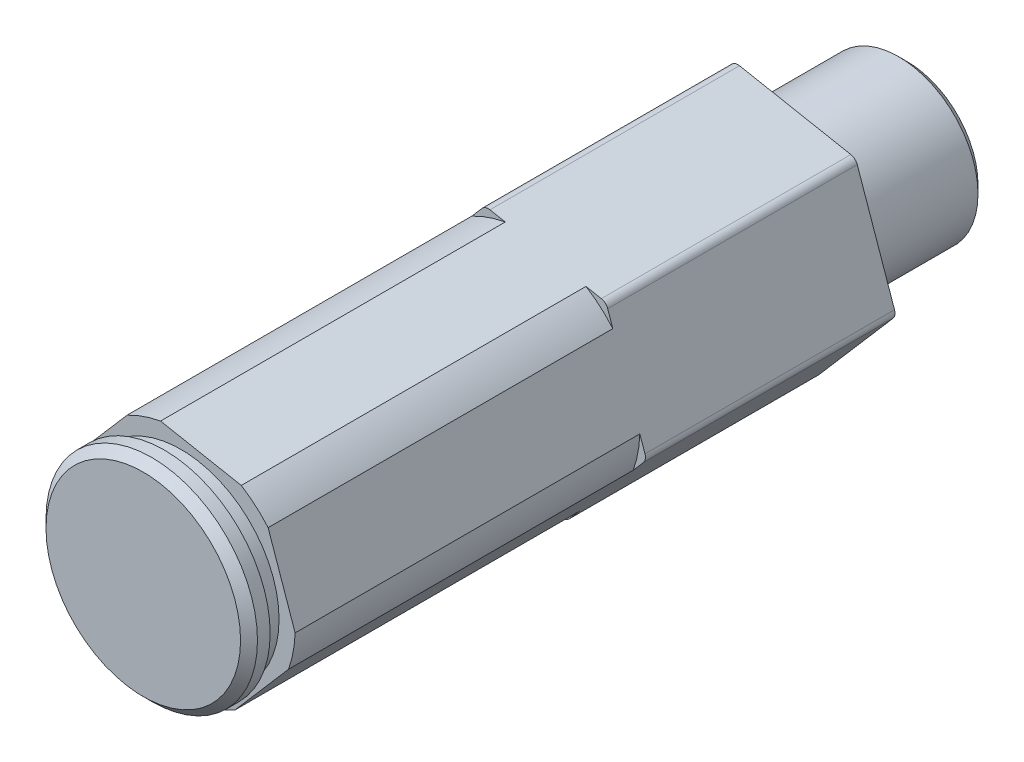
ISO-10303-21;
HEADER;
FILE_DESCRIPTION(('STEP AP214'),'2;1');
FILE_NAME('part.step','',(''),(''),'','','');
FILE_SCHEMA(('AUTOMOTIVE_DESIGN { 1 0 10303 214 1 1 1 1 }'));
ENDSEC;
DATA;
#1=APPLICATION_CONTEXT('core data for automotive mechanical design processes');
#2=APPLICATION_PROTOCOL_DEFINITION('international standard','automotive_design',2000,#1);
#3=PRODUCT_CONTEXT('',#1,'mechanical');
#4=PRODUCT('Part','Part','',(#3));
#5=PRODUCT_RELATED_PRODUCT_CATEGORY('part','',(#4));
#6=PRODUCT_DEFINITION_FORMATION('','',#4);
#7=PRODUCT_DEFINITION_CONTEXT('part definition',#1,'design');
#8=PRODUCT_DEFINITION('design','',#6,#7);
#9=PRODUCT_DEFINITION_SHAPE('','',#8);
#10=(LENGTH_UNIT() NAMED_UNIT(*) SI_UNIT(.MILLI.,.METRE.));
#11=(NAMED_UNIT(*) PLANE_ANGLE_UNIT() SI_UNIT($,.RADIAN.));
#12=(NAMED_UNIT(*) SI_UNIT($,.STERADIAN.) SOLID_ANGLE_UNIT());
#13=UNCERTAINTY_MEASURE_WITH_UNIT(LENGTH_MEASURE(1.E-05),#10,'distance_accuracy_value','');
#14=(GEOMETRIC_REPRESENTATION_CONTEXT(3) GLOBAL_UNCERTAINTY_ASSIGNED_CONTEXT((#13)) GLOBAL_UNIT_ASSIGNED_CONTEXT((#10,
#11,#12)) REPRESENTATION_CONTEXT('',''));
#15=CARTESIAN_POINT('',(0.,0.,0.));
#16=DIRECTION('',(0.,0.,1.));
#17=DIRECTION('',(1.,0.,0.));
#18=AXIS2_PLACEMENT_3D('',#15,#16,#17);
#19=CARTESIAN_POINT('',(0.,0.,22.9362));
#20=DIRECTION('',(0.,0.,1.));
#21=DIRECTION('',(1.,0.,0.));
#22=AXIS2_PLACEMENT_3D('',#19,#20,#21);
#23=CYLINDRICAL_SURFACE('',#22,6.862299966);
#24=CARTESIAN_POINT('',(0.,0.,-0.0254000000000018));
#25=DIRECTION('',(0.,0.,-1.));
#26=DIRECTION('',(-1.,0.,0.));
#27=AXIS2_PLACEMENT_3D('',#24,#25,#26);
#28=CIRCLE('',#27,6.862299966);
#29=CARTESIAN_POINT('',(6.85862382577054,-0.224588601527922,-0.0254000000000018));
#30=VERTEX_POINT('',#29);
#31=CARTESIAN_POINT('',(6.45951838185615,-2.31641600275642,-0.0254000000000018));
#32=VERTEX_POINT('',#31);
#33=EDGE_CURVE('E204',#30,#32,#28,.T.);
#34=ORIENTED_EDGE('',*,*,#33,.F.);
#35=DIRECTION('',(0.,0.,1.));
#36=VECTOR('',#35,1.);
#37=CARTESIAN_POINT('',(6.85862382577054,-0.224588601527922,22.9362));
#38=LINE('',#37,#36);
#39=CARTESIAN_POINT('',(6.85862382577054,-0.224588601527908,20.6756));
#40=VERTEX_POINT('',#39);
#41=EDGE_CURVE('E221',#40,#30,#38,.F.);
#42=ORIENTED_EDGE('',*,*,#41,.F.);
#43=CARTESIAN_POINT('',(0.,0.,20.6756));
#44=DIRECTION('',(0.,0.,1.));
#45=DIRECTION('',(1.,0.,0.));
#46=AXIS2_PLACEMENT_3D('',#43,#44,#45);
#47=CIRCLE('',#46,6.86229996599999);
#48=CARTESIAN_POINT('',(6.45951838185614,-2.31641600275645,20.6756));
#49=VERTEX_POINT('',#48);
#50=EDGE_CURVE('E207',#49,#40,#47,.T.);
#51=ORIENTED_EDGE('',*,*,#50,.F.);
#52=DIRECTION('',(0.,0.,1.));
#53=VECTOR('',#52,1.);
#54=CARTESIAN_POINT('',(6.45951838185615,-2.31641600275642,22.9362));
#55=LINE('',#54,#53);
#56=EDGE_CURVE('E201',#32,#49,#55,.T.);
#57=ORIENTED_EDGE('',*,*,#56,.F.);
#58=EDGE_LOOP('',(#34,#42,#51,#57));
#59=FACE_BOUND('',#58,.T.);
#60=ADVANCED_FACE('F38',(#59),#23,.T.);
#61=CARTESIAN_POINT('',(0.,0.,-0.0254000000000018));
#62=DIRECTION('',(0.,0.,-1.));
#63=DIRECTION('',(-1.,0.,0.));
#64=AXIS2_PLACEMENT_3D('',#61,#62,#63);
#65=CIRCLE('',#64,6.862299966);
#66=CARTESIAN_POINT('',(3.23481247856166,-6.05203676888247,-0.0254000000000018));
#67=VERTEX_POINT('',#66);
#68=CARTESIAN_POINT('',(1.2236840868082,-6.75231501627819,-0.0254000000000018));
#69=VERTEX_POINT('',#68);
#70=EDGE_CURVE('E222',#67,#69,#65,.T.);
#71=ORIENTED_EDGE('',*,*,#70,.F.);
#72=DIRECTION('',(0.,0.,1.));
#73=VECTOR('',#72,1.);
#74=CARTESIAN_POINT('',(3.23481247856166,-6.05203676888247,22.9362));
#75=LINE('',#74,#73);
#76=CARTESIAN_POINT('',(3.23481247856168,-6.05203676888245,20.6756));
#77=VERTEX_POINT('',#76);
#78=EDGE_CURVE('E212',#77,#67,#75,.F.);
#79=ORIENTED_EDGE('',*,*,#78,.F.);
#80=CARTESIAN_POINT('',(1.22368408680819,-6.75231501627819,20.6756));
#81=VERTEX_POINT('',#80);
#82=EDGE_CURVE('E487',#81,#77,#47,.T.);
#83=ORIENTED_EDGE('',*,*,#82,.F.);
#84=DIRECTION('',(0.,0.,1.));
#85=VECTOR('',#84,1.);
#86=CARTESIAN_POINT('',(1.2236840868082,-6.75231501627819,22.9362));
#87=LINE('',#86,#85);
#88=EDGE_CURVE('E284',#69,#81,#87,.T.);
#89=ORIENTED_EDGE('',*,*,#88,.F.);
#90=EDGE_LOOP('',(#71,#79,#83,#89));
#91=FACE_BOUND('',#90,.T.);
#92=ADVANCED_FACE('F448',(#91),#23,.T.);
#93=CARTESIAN_POINT('',(0.,0.,-0.0254000000000018));
#94=DIRECTION('',(0.,0.,-1.));
#95=DIRECTION('',(-1.,0.,0.));
#96=AXIS2_PLACEMENT_3D('',#93,#94,#95);
#97=CIRCLE('',#96,6.862299966);
#98=CARTESIAN_POINT('',(-3.62381134720887,-5.82744816735454,-0.0254000000000018));
#99=VERTEX_POINT('',#98);
#100=CARTESIAN_POINT('',(-5.23583429504795,-4.43589901352176,-0.0254000000000018));
#101=VERTEX_POINT('',#100);
#102=EDGE_CURVE('E246',#99,#101,#97,.T.);
#103=ORIENTED_EDGE('',*,*,#102,.F.);
#104=DIRECTION('',(0.,0.,1.));
#105=VECTOR('',#104,1.);
#106=CARTESIAN_POINT('',(-3.62381134720887,-5.82744816735454,22.9362));
#107=LINE('',#106,#105);
#108=CARTESIAN_POINT('',(-3.62381134720886,-5.82744816735454,20.6756));
#109=VERTEX_POINT('',#108);
#110=EDGE_CURVE('E281',#109,#99,#107,.F.);
#111=ORIENTED_EDGE('',*,*,#110,.F.);
#112=CARTESIAN_POINT('',(-5.23583429504796,-4.43589901352174,20.6756));
#113=VERTEX_POINT('',#112);
#114=EDGE_CURVE('E483',#113,#109,#47,.T.);
#115=ORIENTED_EDGE('',*,*,#114,.F.);
#116=DIRECTION('',(0.,0.,1.));
#117=VECTOR('',#116,1.);
#118=CARTESIAN_POINT('',(-5.23583429504795,-4.43589901352176,22.9362));
#119=LINE('',#118,#117);
#120=EDGE_CURVE('E276',#101,#113,#119,.T.);
#121=ORIENTED_EDGE('',*,*,#120,.F.);
#122=EDGE_LOOP('',(#103,#111,#115,#121));
#123=FACE_BOUND('',#122,.T.);
#124=ADVANCED_FACE('F454',(#123),#23,.T.);
#125=CARTESIAN_POINT('',(0.,0.,-0.0254000000000018));
#126=DIRECTION('',(0.,0.,-1.));
#127=DIRECTION('',(-1.,0.,0.));
#128=AXIS2_PLACEMENT_3D('',#125,#126,#127);
#129=CIRCLE('',#128,6.862299966);
#130=CARTESIAN_POINT('',(-6.85862382577054,0.224588601527921,-0.0254000000000018));
#131=VERTEX_POINT('',#130);
#132=CARTESIAN_POINT('',(-6.45951838185614,2.31641600275644,-0.0254000000000018));
#133=VERTEX_POINT('',#132);
#134=EDGE_CURVE('E243',#131,#133,#129,.T.);
#135=ORIENTED_EDGE('',*,*,#134,.F.);
#136=DIRECTION('',(0.,0.,1.));
#137=VECTOR('',#136,1.);
#138=CARTESIAN_POINT('',(-6.85862382577054,0.224588601527921,22.9362));
#139=LINE('',#138,#137);
#140=CARTESIAN_POINT('',(-6.85862382577054,0.224588601527902,20.6756));
#141=VERTEX_POINT('',#140);
#142=EDGE_CURVE('E273',#141,#131,#139,.F.);
#143=ORIENTED_EDGE('',*,*,#142,.F.);
#144=CARTESIAN_POINT('',(-6.45951838185614,2.31641600275645,20.6756));
#145=VERTEX_POINT('',#144);
#146=EDGE_CURVE('E481',#145,#141,#47,.T.);
#147=ORIENTED_EDGE('',*,*,#146,.F.);
#148=DIRECTION('',(0.,0.,1.));
#149=VECTOR('',#148,1.);
#150=CARTESIAN_POINT('',(-6.45951838185614,2.31641600275644,22.9362));
#151=LINE('',#150,#149);
#152=EDGE_CURVE('E268',#133,#145,#151,.T.);
#153=ORIENTED_EDGE('',*,*,#152,.F.);
#154=EDGE_LOOP('',(#135,#143,#147,#153));
#155=FACE_BOUND('',#154,.T.);
#156=ADVANCED_FACE('F467',(#155),#23,.T.);
#157=CARTESIAN_POINT('',(0.,0.,-0.0254000000000018));
#158=DIRECTION('',(0.,0.,-1.));
#159=DIRECTION('',(-1.,0.,0.));
#160=AXIS2_PLACEMENT_3D('',#157,#158,#159);
#161=CIRCLE('',#160,6.862299966);
#162=CARTESIAN_POINT('',(-3.23481247856168,6.05203676888246,-0.0254000000000018));
#163=VERTEX_POINT('',#162);
#164=CARTESIAN_POINT('',(-1.22368408680819,6.75231501627819,-0.0254000000000018));
#165=VERTEX_POINT('',#164);
#166=EDGE_CURVE('E240',#163,#165,#161,.T.);
#167=ORIENTED_EDGE('',*,*,#166,.F.);
#168=DIRECTION('',(0.,0.,1.));
#169=VECTOR('',#168,1.);
#170=CARTESIAN_POINT('',(-3.23481247856168,6.05203676888246,22.9362));
#171=LINE('',#170,#169);
#172=CARTESIAN_POINT('',(-3.23481247856169,6.05203676888245,20.6756));
#173=VERTEX_POINT('',#172);
#174=EDGE_CURVE('E265',#173,#163,#171,.F.);
#175=ORIENTED_EDGE('',*,*,#174,.F.);
#176=CARTESIAN_POINT('',(-1.22368408680818,6.75231501627819,20.6756));
#177=VERTEX_POINT('',#176);
#178=EDGE_CURVE('E304',#177,#173,#47,.T.);
#179=ORIENTED_EDGE('',*,*,#178,.F.);
#180=DIRECTION('',(0.,0.,1.));
#181=VECTOR('',#180,1.);
#182=CARTESIAN_POINT('',(-1.22368408680819,6.75231501627819,22.9362));
#183=LINE('',#182,#181);
#184=EDGE_CURVE('E260',#165,#177,#183,.T.);
#185=ORIENTED_EDGE('',*,*,#184,.F.);
#186=EDGE_LOOP('',(#167,#175,#179,#185));
#187=FACE_BOUND('',#186,.T.);
#188=ADVANCED_FACE('F459',(#187),#23,.T.);
#189=CARTESIAN_POINT('',(0.,0.,-0.0254000000000018));
#190=DIRECTION('',(0.,0.,-1.));
#191=DIRECTION('',(-1.,0.,0.));
#192=AXIS2_PLACEMENT_3D('',#189,#190,#191);
#193=CIRCLE('',#192,6.862299966);
#194=CARTESIAN_POINT('',(3.62381134720886,5.82744816735455,-0.0254000000000018));
#195=VERTEX_POINT('',#194);
#196=CARTESIAN_POINT('',(5.23583429504794,4.43589901352176,-0.0254000000000018));
#197=VERTEX_POINT('',#196);
#198=EDGE_CURVE('E237',#195,#197,#193,.T.);
#199=ORIENTED_EDGE('',*,*,#198,.F.);
#200=DIRECTION('',(0.,0.,1.));
#201=VECTOR('',#200,1.);
#202=CARTESIAN_POINT('',(3.62381134720886,5.82744816735455,22.9362));
#203=LINE('',#202,#201);
#204=CARTESIAN_POINT('',(3.62381134720885,5.82744816735455,20.6756));
#205=VERTEX_POINT('',#204);
#206=EDGE_CURVE('E257',#205,#195,#203,.F.);
#207=ORIENTED_EDGE('',*,*,#206,.F.);
#208=CARTESIAN_POINT('',(5.23583429504795,4.43589901352175,20.6756));
#209=VERTEX_POINT('',#208);
#210=EDGE_CURVE('E300',#209,#205,#47,.T.);
#211=ORIENTED_EDGE('',*,*,#210,.F.);
#212=DIRECTION('',(0.,0.,1.));
#213=VECTOR('',#212,1.);
#214=CARTESIAN_POINT('',(5.23583429504795,4.43589901352176,22.9362));
#215=LINE('',#214,#213);
#216=EDGE_CURVE('E252',#197,#209,#215,.T.);
#217=ORIENTED_EDGE('',*,*,#216,.F.);
#218=EDGE_LOOP('',(#199,#207,#211,#217));
#219=FACE_BOUND('',#218,.T.);
#220=ADVANCED_FACE('F450',(#219),#23,.T.);
#221=CARTESIAN_POINT('',(0.,4.7625,-15.0114));
#222=DIRECTION('',(0.,0.,1.));
#223=DIRECTION('',(1.,0.,0.));
#224=AXIS2_PLACEMENT_3D('',#221,#222,#223);
#225=PLANE('',#224);
#226=CARTESIAN_POINT('',(0.,0.,-15.0114));
#227=DIRECTION('',(0.,0.,1.));
#228=DIRECTION('',(1.,0.,0.));
#229=AXIS2_PLACEMENT_3D('',#226,#227,#228);
#230=CIRCLE('',#229,4.7625);
#231=CARTESIAN_POINT('',(4.7625,0.,-15.0114));
#232=VERTEX_POINT('',#231);
#233=EDGE_CURVE('E303',#232,#232,#230,.T.);
#234=ORIENTED_EDGE('',*,*,#233,.T.);
#235=EDGE_LOOP('',(#234));
#236=FACE_BOUND('',#235,.T.);
#237=DIRECTION('',(-0.328837014120275,0.944386688885682,0.));
#238=VECTOR('',#237,1.);
#239=CARTESIAN_POINT('',(4.56823802416892,6.35316806990992,-15.0114));
#240=LINE('',#239,#238);
#241=CARTESIAN_POINT('',(7.1664837579922,-1.10873123008568,-15.0114));
#242=VERTEX_POINT('',#241);
#243=CARTESIAN_POINT('',(4.92797436282629,5.32004164207953,-15.0114));
#244=VERTEX_POINT('',#243);
#245=EDGE_CURVE('E254',#242,#244,#240,.T.);
#246=ORIENTED_EDGE('',*,*,#245,.F.);
#247=CARTESIAN_POINT('',(6.68673532003827,-1.27578043325878,-15.0114));
#248=DIRECTION('',(0.,0.,1.));
#249=DIRECTION('',(1.,0.,0.));
#250=AXIS2_PLACEMENT_3D('',#247,#248,#249);
#251=CIRCLE('',#250,0.508);
#252=CARTESIAN_POINT('',(7.07127839264509,-1.60773016636624,-15.0114));
#253=VERTEX_POINT('',#252);
#254=EDGE_CURVE('E346',#242,#253,#251,.F.);
#255=ORIENTED_EDGE('',*,*,#254,.T.);
#256=DIRECTION('',(0.653444356510735,0.756974552375621,0.));
#257=VECTOR('',#256,1.);
#258=CARTESIAN_POINT('',(7.20289199861723,-1.45526400842235,-15.0114));
#259=LINE('',#258,#257);
#260=CARTESIAN_POINT('',(2.62305246777273,-6.76072260527266,-15.0114));
#261=VERTEX_POINT('',#260);
#262=EDGE_CURVE('E211',#261,#253,#259,.T.);
#263=ORIENTED_EDGE('',*,*,#262,.F.);
#264=CARTESIAN_POINT('',(2.23850939516591,-6.4287728721652,-15.0114));
#265=DIRECTION('',(0.,0.,1.));
#266=DIRECTION('',(1.,0.,0.));
#267=AXIS2_PLACEMENT_3D('',#264,#265,#266);
#268=CIRCLE('',#267,0.508);
#269=CARTESIAN_POINT('',(2.1433040298188,-6.92777180844576,-15.0114));
#270=VERTEX_POINT('',#269);
#271=EDGE_CURVE('E338',#261,#270,#268,.F.);
#272=ORIENTED_EDGE('',*,*,#271,.T.);
#273=DIRECTION('',(0.982281370631009,-0.187412136510061,0.));
#274=VECTOR('',#273,1.);
#275=CARTESIAN_POINT('',(-2.07679916236833,-6.12260683312646,-15.0114));
#276=LINE('',#275,#274);
#277=CARTESIAN_POINT('',(-4.54343129021948,-5.65199137518697,-15.0114));
#278=VERTEX_POINT('',#277);
#279=EDGE_CURVE('E286',#278,#270,#276,.T.);
#280=ORIENTED_EDGE('',*,*,#279,.F.);
#281=CARTESIAN_POINT('',(-4.44822592487236,-5.15299243890642,-15.0114));
#282=DIRECTION('',(0.,0.,1.));
#283=DIRECTION('',(1.,0.,0.));
#284=AXIS2_PLACEMENT_3D('',#281,#282,#283);
#285=CIRCLE('',#284,0.508);
#286=CARTESIAN_POINT('',(-4.92797436282629,-5.32004164207952,-15.0114));
#287=VERTEX_POINT('',#286);
#288=EDGE_CURVE('E340',#278,#287,#285,.F.);
#289=ORIENTED_EDGE('',*,*,#288,.T.);
#290=DIRECTION('',(0.328837014120275,-0.944386688885682,0.));
#291=VECTOR('',#290,1.);
#292=CARTESIAN_POINT('',(-7.52622009664957,2.14185765791608,-15.0114));
#293=LINE('',#292,#291);
#294=CARTESIAN_POINT('',(-7.1664837579922,1.10873123008568,-15.0114));
#295=VERTEX_POINT('',#294);
#296=EDGE_CURVE('E278',#295,#287,#293,.T.);
#297=ORIENTED_EDGE('',*,*,#296,.F.);
#298=CARTESIAN_POINT('',(-6.68673532003828,1.27578043325878,-15.0114));
#299=DIRECTION('',(0.,0.,1.));
#300=DIRECTION('',(1.,0.,0.));
#301=AXIS2_PLACEMENT_3D('',#298,#299,#300);
#302=CIRCLE('',#301,0.508);
#303=CARTESIAN_POINT('',(-7.07127839264509,1.60773016636624,-15.0114));
#304=VERTEX_POINT('',#303);
#305=EDGE_CURVE('E342',#295,#304,#302,.F.);
#306=ORIENTED_EDGE('',*,*,#305,.T.);
#307=DIRECTION('',(-0.653444356510735,-0.756974552375621,0.));
#308=VECTOR('',#307,1.);
#309=CARTESIAN_POINT('',(-2.49143886180059,6.91318876321654,-15.0114));
#310=LINE('',#309,#308);
#311=CARTESIAN_POINT('',(-2.62305246777273,6.76072260527266,-15.0114));
#312=VERTEX_POINT('',#311);
#313=EDGE_CURVE('E270',#312,#304,#310,.T.);
#314=ORIENTED_EDGE('',*,*,#313,.F.);
#315=CARTESIAN_POINT('',(-2.23850939516591,6.42877287216521,-15.0114));
#316=DIRECTION('',(0.,0.,1.));
#317=DIRECTION('',(1.,0.,0.));
#318=AXIS2_PLACEMENT_3D('',#315,#316,#317);
#319=CIRCLE('',#318,0.508);
#320=CARTESIAN_POINT('',(-2.1433040298188,6.92777180844576,-15.0114));
#321=VERTEX_POINT('',#320);
#322=EDGE_CURVE('E344',#312,#321,#319,.F.);
#323=ORIENTED_EDGE('',*,*,#322,.T.);
#324=DIRECTION('',(-0.982281370631009,0.187412136510061,0.));
#325=VECTOR('',#324,1.);
#326=CARTESIAN_POINT('',(0.323328098032339,6.45715635050627,-15.0114));
#327=LINE('',#326,#325);
#328=CARTESIAN_POINT('',(4.54343129021947,5.65199137518698,-15.0114));
#329=VERTEX_POINT('',#328);
#330=EDGE_CURVE('E262',#329,#321,#327,.T.);
#331=ORIENTED_EDGE('',*,*,#330,.F.);
#332=CARTESIAN_POINT('',(4.44822592487236,5.15299243890643,-15.0114));
#333=DIRECTION('',(0.,0.,1.));
#334=DIRECTION('',(1.,0.,0.));
#335=AXIS2_PLACEMENT_3D('',#332,#333,#334);
#336=CIRCLE('',#335,0.508);
#337=EDGE_CURVE('E336',#329,#244,#336,.F.);
#338=ORIENTED_EDGE('',*,*,#337,.T.);
#339=EDGE_LOOP('',(#246,#255,#263,#272,#280,#289,#297,#306,#314,#323,#331,#338));
#340=FACE_BOUND('',#339,.T.);
#341=ADVANCED_FACE('F390',(#236,#340),#225,.F.);
#342=CARTESIAN_POINT('',(0.,6.86229996599999,20.6756));
#343=DIRECTION('',(0.,0.,-1.));
#344=DIRECTION('',(-1.,0.,0.));
#345=AXIS2_PLACEMENT_3D('',#342,#343,#344);
#346=PLANE('',#345);
#347=CARTESIAN_POINT('',(0.,0.,20.6756));
#348=DIRECTION('',(0.,0.,1.));
#349=DIRECTION('',(1.,0.,0.));
#350=AXIS2_PLACEMENT_3D('',#347,#348,#349);
#351=CIRCLE('',#350,5.8928);
#352=CARTESIAN_POINT('',(5.8928,0.,20.6756));
#353=VERTEX_POINT('',#352);
#354=EDGE_CURVE('E297',#353,#353,#351,.T.);
#355=ORIENTED_EDGE('',*,*,#354,.F.);
#356=EDGE_LOOP('',(#355));
#357=FACE_BOUND('',#356,.T.);
#358=DIRECTION('',(-0.653444356510735,-0.756974552375621,0.));
#359=VECTOR('',#358,1.);
#360=CARTESIAN_POINT('',(8.24153862712098,-0.252056636816328,20.6756));
#361=LINE('',#360,#359);
#362=EDGE_CURVE('E317',#49,#77,#361,.T.);
#363=ORIENTED_EDGE('',*,*,#362,.F.);
#364=ORIENTED_EDGE('',*,*,#50,.T.);
#365=DIRECTION('',(0.328837014120275,-0.944386688885682,0.));
#366=VECTOR('',#365,1.);
#367=CARTESIAN_POINT('',(3.91614661679637,8.22590872444621,20.6756));
#368=LINE('',#367,#366);
#369=EDGE_CURVE('E307',#209,#40,#368,.T.);
#370=ORIENTED_EDGE('',*,*,#369,.F.);
#371=ORIENTED_EDGE('',*,*,#210,.T.);
#372=DIRECTION('',(0.982281370631009,-0.187412136510061,0.));
#373=VECTOR('',#372,1.);
#374=CARTESIAN_POINT('',(-0.0632271230988616,6.53090827336396,20.6756));
#375=LINE('',#374,#373);
#376=EDGE_CURVE('E309',#177,#205,#375,.T.);
#377=ORIENTED_EDGE('',*,*,#376,.F.);
#378=ORIENTED_EDGE('',*,*,#178,.T.);
#379=DIRECTION('',(0.653444356510735,0.756974552375621,0.));
#380=VECTOR('',#379,1.);
#381=CARTESIAN_POINT('',(-1.45279223329684,8.11639613482257,20.6756));
#382=LINE('',#381,#380);
#383=EDGE_CURVE('E311',#145,#173,#382,.T.);
#384=ORIENTED_EDGE('',*,*,#383,.F.);
#385=ORIENTED_EDGE('',*,*,#146,.T.);
#386=DIRECTION('',(-0.328837014120275,0.944386688885682,0.));
#387=VECTOR('',#386,1.);
#388=CARTESIAN_POINT('',(-8.17831150402212,4.01459831245237,20.6756));
#389=LINE('',#388,#387);
#390=EDGE_CURVE('E313',#113,#141,#389,.T.);
#391=ORIENTED_EDGE('',*,*,#390,.F.);
#392=ORIENTED_EDGE('',*,*,#114,.T.);
#393=DIRECTION('',(-0.982281370631009,0.187412136510061,0.));
#394=VECTOR('',#393,1.);
#395=CARTESIAN_POINT('',(-2.46335438349953,-6.04885491026878,20.6756));
#396=LINE('',#395,#394);
#397=EDGE_CURVE('E315',#81,#109,#396,.T.);
#398=ORIENTED_EDGE('',*,*,#397,.F.);
#399=ORIENTED_EDGE('',*,*,#82,.T.);
#400=EDGE_LOOP('',(#363,#364,#370,#371,#377,#378,#384,#385,#391,#392,#398,#399));
#401=FACE_BOUND('',#400,.T.);
#402=ADVANCED_FACE('F465',(#357,#401),#346,.F.);
#403=CARTESIAN_POINT('',(0.,6.35,22.9362));
#404=DIRECTION('',(0.,0.,-1.));
#405=DIRECTION('',(-1.,0.,0.));
#406=AXIS2_PLACEMENT_3D('',#403,#404,#405);
#407=PLANE('',#406);
#408=CARTESIAN_POINT('',(0.,0.,22.9362));
#409=DIRECTION('',(0.,0.,-1.));
#410=DIRECTION('',(-1.,0.,0.));
#411=AXIS2_PLACEMENT_3D('',#408,#409,#410);
#412=CIRCLE('',#411,5.84199999999999);
#413=CARTESIAN_POINT('',(-5.84199999999999,0.,22.9362));
#414=VERTEX_POINT('',#413);
#415=EDGE_CURVE('E325',#414,#414,#412,.F.);
#416=ORIENTED_EDGE('',*,*,#415,.T.);
#417=EDGE_LOOP('',(#416));
#418=FACE_BOUND('',#417,.T.);
#419=ADVANCED_FACE('F540',(#418),#407,.F.);
#420=CARTESIAN_POINT('',(0.,0.,-22.9362));
#421=DIRECTION('',(0.,0.,1.));
#422=DIRECTION('',(1.,0.,0.));
#423=AXIS2_PLACEMENT_3D('',#420,#421,#422);
#424=PLANE('',#423);
#425=CARTESIAN_POINT('',(0.,0.,-22.9362));
#426=DIRECTION('',(0.,0.,1.));
#427=DIRECTION('',(1.,0.,0.));
#428=AXIS2_PLACEMENT_3D('',#425,#426,#427);
#429=CIRCLE('',#428,4.2545);
#430=CARTESIAN_POINT('',(4.2545,0.,-22.9362));
#431=VERTEX_POINT('',#430);
#432=EDGE_CURVE('E322',#431,#431,#429,.F.);
#433=ORIENTED_EDGE('',*,*,#432,.T.);
#434=EDGE_LOOP('',(#433));
#435=FACE_BOUND('',#434,.T.);
#436=ADVANCED_FACE('F545',(#435),#424,.F.);
#437=CARTESIAN_POINT('',(0.,0.,22.9362));
#438=DIRECTION('',(0.,0.,1.));
#439=DIRECTION('',(1.,0.,0.));
#440=AXIS2_PLACEMENT_3D('',#437,#438,#439);
#441=CYLINDRICAL_SURFACE('',#440,4.7625);
#442=CARTESIAN_POINT('',(0.,0.,-22.4282));
#443=DIRECTION('',(0.,0.,1.));
#444=DIRECTION('',(1.,0.,0.));
#445=AXIS2_PLACEMENT_3D('',#442,#443,#444);
#446=CIRCLE('',#445,4.7625);
#447=CARTESIAN_POINT('',(4.7625,0.,-22.4282));
#448=VERTEX_POINT('',#447);
#449=EDGE_CURVE('E319',#448,#448,#446,.T.);
#450=ORIENTED_EDGE('',*,*,#449,.T.);
#451=EDGE_LOOP('',(#450));
#452=FACE_BOUND('',#451,.T.);
#453=ORIENTED_EDGE('',*,*,#233,.F.);
#454=EDGE_LOOP('',(#453));
#455=FACE_BOUND('',#454,.T.);
#456=ADVANCED_FACE('F537',(#452,#455),#441,.T.);
#457=CARTESIAN_POINT('',(0.,0.,22.9362));
#458=DIRECTION('',(0.,0.,1.));
#459=DIRECTION('',(1.,0.,0.));
#460=AXIS2_PLACEMENT_3D('',#457,#458,#459);
#461=CYLINDRICAL_SURFACE('',#460,5.8928);
#462=CARTESIAN_POINT('',(0.,0.,21.6662));
#463=DIRECTION('',(0.,0.,1.));
#464=DIRECTION('',(1.,0.,0.));
#465=AXIS2_PLACEMENT_3D('',#462,#463,#464);
#466=CIRCLE('',#465,5.8928);
#467=CARTESIAN_POINT('',(5.8928,0.,21.6662));
#468=VERTEX_POINT('',#467);
#469=EDGE_CURVE('E294',#468,#468,#466,.T.);
#470=ORIENTED_EDGE('',*,*,#469,.F.);
#471=EDGE_LOOP('',(#470));
#472=FACE_BOUND('',#471,.T.);
#473=ORIENTED_EDGE('',*,*,#354,.T.);
#474=EDGE_LOOP('',(#473));
#475=FACE_BOUND('',#474,.T.);
#476=ADVANCED_FACE('F534',(#472,#475),#461,.T.);
#477=CARTESIAN_POINT('',(0.,5.8928,21.6662));
#478=DIRECTION('',(0.,0.,1.));
#479=DIRECTION('',(1.,0.,0.));
#480=AXIS2_PLACEMENT_3D('',#477,#478,#479);
#481=PLANE('',#480);
#482=CARTESIAN_POINT('',(0.,0.,21.6662));
#483=DIRECTION('',(0.,0.,1.));
#484=DIRECTION('',(1.,0.,0.));
#485=AXIS2_PLACEMENT_3D('',#482,#483,#484);
#486=CIRCLE('',#485,6.35);
#487=CARTESIAN_POINT('',(6.35,0.,21.6662));
#488=VERTEX_POINT('',#487);
#489=EDGE_CURVE('E291',#488,#488,#486,.T.);
#490=ORIENTED_EDGE('',*,*,#489,.F.);
#491=EDGE_LOOP('',(#490));
#492=FACE_BOUND('',#491,.T.);
#493=ORIENTED_EDGE('',*,*,#469,.T.);
#494=EDGE_LOOP('',(#493));
#495=FACE_BOUND('',#494,.T.);
#496=ADVANCED_FACE('F530',(#492,#495),#481,.F.);
#497=CARTESIAN_POINT('',(0.,0.,22.9362));
#498=DIRECTION('',(0.,0.,1.));
#499=DIRECTION('',(1.,0.,0.));
#500=AXIS2_PLACEMENT_3D('',#497,#498,#499);
#501=CYLINDRICAL_SURFACE('',#500,6.35);
#502=CARTESIAN_POINT('',(0.,0.,22.4282));
#503=DIRECTION('',(0.,0.,-1.));
#504=DIRECTION('',(-1.,0.,0.));
#505=AXIS2_PLACEMENT_3D('',#502,#503,#504);
#506=CIRCLE('',#505,6.35);
#507=CARTESIAN_POINT('',(-6.35,0.,22.4282));
#508=VERTEX_POINT('',#507);
#509=EDGE_CURVE('E328',#508,#508,#506,.T.);
#510=ORIENTED_EDGE('',*,*,#509,.T.);
#511=EDGE_LOOP('',(#510));
#512=FACE_BOUND('',#511,.T.);
#513=ORIENTED_EDGE('',*,*,#489,.T.);
#514=EDGE_LOOP('',(#513));
#515=FACE_BOUND('',#514,.T.);
#516=ADVANCED_FACE('F524',(#512,#515),#501,.T.);
#517=CARTESIAN_POINT('',(7.2629296604121,-1.38571411988168,-22.9362));
#518=DIRECTION('',(0.944386688885682,0.328837014120275,0.));
#519=DIRECTION('',(-0.328837014120275,0.944386688885682,0.));
#520=AXIS2_PLACEMENT_3D('',#517,#518,#519);
#521=PLANE('',#520);
#522=DIRECTION('',(-0.328837014120275,0.944386688885682,0.));
#523=VECTOR('',#522,1.);
#524=CARTESIAN_POINT('',(4.83152846040638,5.59702453187552,-0.0254000000000018));
#525=LINE('',#524,#523);
#526=CARTESIAN_POINT('',(7.1664837579922,-1.10873123008568,-0.0254000000000018));
#527=VERTEX_POINT('',#526);
#528=EDGE_CURVE('E220',#527,#30,#525,.T.);
#529=ORIENTED_EDGE('',*,*,#528,.F.);
#530=DIRECTION('',(0.,0.,-1.));
#531=VECTOR('',#530,1.);
#532=CARTESIAN_POINT('',(7.1664837579922,-1.10873123008568,-22.9362));
#533=LINE('',#532,#531);
#534=EDGE_CURVE('E333',#527,#242,#533,.T.);
#535=ORIENTED_EDGE('',*,*,#534,.T.);
#536=ORIENTED_EDGE('',*,*,#245,.T.);
#537=DIRECTION('',(0.,0.,-1.));
#538=VECTOR('',#537,1.);
#539=CARTESIAN_POINT('',(4.92797436282628,5.32004164207953,-22.9362));
#540=LINE('',#539,#538);
#541=CARTESIAN_POINT('',(4.92797436282628,5.32004164207953,-0.0254000000000018));
#542=VERTEX_POINT('',#541);
#543=EDGE_CURVE('E331',#244,#542,#540,.F.);
#544=ORIENTED_EDGE('',*,*,#543,.T.);
#545=EDGE_CURVE('E231',#197,#542,#525,.T.);
#546=ORIENTED_EDGE('',*,*,#545,.F.);
#547=ORIENTED_EDGE('',*,*,#216,.T.);
#548=ORIENTED_EDGE('',*,*,#369,.T.);
#549=ORIENTED_EDGE('',*,*,#41,.T.);
#550=EDGE_LOOP('',(#529,#535,#536,#544,#546,#547,#548,#549));
#551=FACE_BOUND('',#550,.T.);
#552=ADVANCED_FACE('F431',(#551),#521,.T.);
#553=CARTESIAN_POINT('',(4.83152846040638,5.59702453187553,-22.9362));
#554=DIRECTION('',(0.187412136510061,0.982281370631009,0.));
#555=DIRECTION('',(-0.982281370631009,0.187412136510061,0.));
#556=AXIS2_PLACEMENT_3D('',#553,#554,#555);
#557=PLANE('',#556);
#558=ORIENTED_EDGE('',*,*,#330,.T.);
#559=DIRECTION('',(0.,0.,-1.));
#560=VECTOR('',#559,1.);
#561=CARTESIAN_POINT('',(-2.1433040298188,6.92777180844576,-22.9362));
#562=LINE('',#561,#560);
#563=CARTESIAN_POINT('',(-2.1433040298188,6.92777180844575,-0.0254000000000018));
#564=VERTEX_POINT('',#563);
#565=EDGE_CURVE('E362',#321,#564,#562,.F.);
#566=ORIENTED_EDGE('',*,*,#565,.T.);
#567=DIRECTION('',(-0.982281370631009,0.187412136510061,0.));
#568=VECTOR('',#567,1.);
#569=CARTESIAN_POINT('',(-2.43140120000571,6.9827386517572,-0.0254000000000018));
#570=LINE('',#569,#568);
#571=EDGE_CURVE('E500',#165,#564,#570,.T.);
#572=ORIENTED_EDGE('',*,*,#571,.F.);
#573=ORIENTED_EDGE('',*,*,#184,.T.);
#574=ORIENTED_EDGE('',*,*,#376,.T.);
#575=ORIENTED_EDGE('',*,*,#206,.T.);
#576=CARTESIAN_POINT('',(4.54343129021947,5.65199137518697,-0.0254000000000018));
#577=VERTEX_POINT('',#576);
#578=EDGE_CURVE('E426',#577,#195,#570,.T.);
#579=ORIENTED_EDGE('',*,*,#578,.F.);
#580=DIRECTION('',(0.,0.,-1.));
#581=VECTOR('',#580,1.);
#582=CARTESIAN_POINT('',(4.54343129021947,5.65199137518698,-22.9362));
#583=LINE('',#582,#581);
#584=EDGE_CURVE('E359',#577,#329,#583,.T.);
#585=ORIENTED_EDGE('',*,*,#584,.T.);
#586=EDGE_LOOP('',(#558,#566,#572,#573,#574,#575,#579,#585));
#587=FACE_BOUND('',#586,.T.);
#588=ADVANCED_FACE('F421',(#587),#557,.T.);
#589=CARTESIAN_POINT('',(-2.43140120000572,6.98273865175721,-22.9362));
#590=DIRECTION('',(-0.756974552375621,0.653444356510735,0.));
#591=DIRECTION('',(-0.653444356510735,-0.756974552375621,0.));
#592=AXIS2_PLACEMENT_3D('',#589,#590,#591);
#593=PLANE('',#592);
#594=DIRECTION('',(-0.653444356510735,-0.756974552375621,0.));
#595=VECTOR('',#594,1.);
#596=CARTESIAN_POINT('',(-7.2629296604121,1.38571411988168,-0.0254000000000018));
#597=LINE('',#596,#595);
#598=CARTESIAN_POINT('',(-2.62305246777272,6.76072260527266,-0.0254000000000018));
#599=VERTEX_POINT('',#598);
#600=EDGE_CURVE('E414',#599,#163,#597,.T.);
#601=ORIENTED_EDGE('',*,*,#600,.F.);
#602=DIRECTION('',(0.,0.,-1.));
#603=VECTOR('',#602,1.);
#604=CARTESIAN_POINT('',(-2.62305246777273,6.76072260527266,-22.9362));
#605=LINE('',#604,#603);
#606=EDGE_CURVE('E356',#599,#312,#605,.T.);
#607=ORIENTED_EDGE('',*,*,#606,.T.);
#608=ORIENTED_EDGE('',*,*,#313,.T.);
#609=DIRECTION('',(0.,0.,-1.));
#610=VECTOR('',#609,1.);
#611=CARTESIAN_POINT('',(-7.07127839264509,1.60773016636624,-22.9362));
#612=LINE('',#611,#610);
#613=CARTESIAN_POINT('',(-7.07127839264509,1.60773016636623,-0.0254000000000018));
#614=VERTEX_POINT('',#613);
#615=EDGE_CURVE('E354',#304,#614,#612,.F.);
#616=ORIENTED_EDGE('',*,*,#615,.T.);
#617=EDGE_CURVE('E498',#133,#614,#597,.T.);
#618=ORIENTED_EDGE('',*,*,#617,.F.);
#619=ORIENTED_EDGE('',*,*,#152,.T.);
#620=ORIENTED_EDGE('',*,*,#383,.T.);
#621=ORIENTED_EDGE('',*,*,#174,.T.);
#622=EDGE_LOOP('',(#601,#607,#608,#616,#618,#619,#620,#621));
#623=FACE_BOUND('',#622,.T.);
#624=ADVANCED_FACE('F410',(#623),#593,.T.);
#625=CARTESIAN_POINT('',(-7.2629296604121,1.38571411988169,-22.9362));
#626=DIRECTION('',(-0.944386688885682,-0.328837014120275,0.));
#627=DIRECTION('',(0.328837014120275,-0.944386688885682,0.));
#628=AXIS2_PLACEMENT_3D('',#625,#626,#627);
#629=PLANE('',#628);
#630=DIRECTION('',(0.328837014120275,-0.944386688885682,0.));
#631=VECTOR('',#630,1.);
#632=CARTESIAN_POINT('',(-4.83152846040638,-5.59702453187552,-0.0254000000000018));
#633=LINE('',#632,#631);
#634=CARTESIAN_POINT('',(-7.1664837579922,1.10873123008569,-0.0254000000000018));
#635=VERTEX_POINT('',#634);
#636=EDGE_CURVE('E402',#635,#131,#633,.T.);
#637=ORIENTED_EDGE('',*,*,#636,.F.);
#638=DIRECTION('',(0.,0.,-1.));
#639=VECTOR('',#638,1.);
#640=CARTESIAN_POINT('',(-7.1664837579922,1.10873123008569,-22.9362));
#641=LINE('',#640,#639);
#642=EDGE_CURVE('E368',#635,#295,#641,.T.);
#643=ORIENTED_EDGE('',*,*,#642,.T.);
#644=ORIENTED_EDGE('',*,*,#296,.T.);
#645=DIRECTION('',(0.,0.,-1.));
#646=VECTOR('',#645,1.);
#647=CARTESIAN_POINT('',(-4.92797436282629,-5.32004164207952,-22.9362));
#648=LINE('',#647,#646);
#649=CARTESIAN_POINT('',(-4.92797436282629,-5.32004164207952,-0.0254000000000018));
#650=VERTEX_POINT('',#649);
#651=EDGE_CURVE('E366',#287,#650,#648,.F.);
#652=ORIENTED_EDGE('',*,*,#651,.T.);
#653=EDGE_CURVE('E496',#101,#650,#633,.T.);
#654=ORIENTED_EDGE('',*,*,#653,.F.);
#655=ORIENTED_EDGE('',*,*,#120,.T.);
#656=ORIENTED_EDGE('',*,*,#390,.T.);
#657=ORIENTED_EDGE('',*,*,#142,.T.);
#658=EDGE_LOOP('',(#637,#643,#644,#652,#654,#655,#656,#657));
#659=FACE_BOUND('',#658,.T.);
#660=ADVANCED_FACE('F399',(#659),#629,.T.);
#661=CARTESIAN_POINT('',(-4.83152846040639,-5.59702453187552,-22.9362));
#662=DIRECTION('',(-0.187412136510061,-0.982281370631009,0.));
#663=DIRECTION('',(0.982281370631009,-0.187412136510061,0.));
#664=AXIS2_PLACEMENT_3D('',#661,#662,#663);
#665=PLANE('',#664);
#666=DIRECTION('',(0.982281370631009,-0.187412136510061,0.));
#667=VECTOR('',#666,1.);
#668=CARTESIAN_POINT('',(2.43140120000572,-6.98273865175721,-0.0254000000000018));
#669=LINE('',#668,#667);
#670=CARTESIAN_POINT('',(-4.54343129021948,-5.65199137518697,-0.0254000000000018));
#671=VERTEX_POINT('',#670);
#672=EDGE_CURVE('E235',#671,#99,#669,.T.);
#673=ORIENTED_EDGE('',*,*,#672,.F.);
#674=DIRECTION('',(0.,0.,-1.));
#675=VECTOR('',#674,1.);
#676=CARTESIAN_POINT('',(-4.54343129021948,-5.65199137518697,-22.9362));
#677=LINE('',#676,#675);
#678=EDGE_CURVE('E374',#671,#278,#677,.T.);
#679=ORIENTED_EDGE('',*,*,#678,.T.);
#680=ORIENTED_EDGE('',*,*,#279,.T.);
#681=DIRECTION('',(0.,0.,-1.));
#682=VECTOR('',#681,1.);
#683=CARTESIAN_POINT('',(2.1433040298188,-6.92777180844576,-22.9362));
#684=LINE('',#683,#682);
#685=CARTESIAN_POINT('',(2.1433040298188,-6.92777180844575,-0.0254000000000018));
#686=VERTEX_POINT('',#685);
#687=EDGE_CURVE('E61',#270,#686,#684,.F.);
#688=ORIENTED_EDGE('',*,*,#687,.T.);
#689=EDGE_CURVE('E230',#69,#686,#669,.T.);
#690=ORIENTED_EDGE('',*,*,#689,.F.);
#691=ORIENTED_EDGE('',*,*,#88,.T.);
#692=ORIENTED_EDGE('',*,*,#397,.T.);
#693=ORIENTED_EDGE('',*,*,#110,.T.);
#694=EDGE_LOOP('',(#673,#679,#680,#688,#690,#691,#692,#693));
#695=FACE_BOUND('',#694,.T.);
#696=ADVANCED_FACE('F391',(#695),#665,.T.);
#697=CARTESIAN_POINT('',(2.43140120000572,-6.98273865175721,-22.9362));
#698=DIRECTION('',(0.756974552375621,-0.653444356510735,0.));
#699=DIRECTION('',(0.653444356510735,0.756974552375621,0.));
#700=AXIS2_PLACEMENT_3D('',#697,#698,#699);
#701=PLANE('',#700);
#702=ORIENTED_EDGE('',*,*,#262,.T.);
#703=DIRECTION('',(0.,0.,-1.));
#704=VECTOR('',#703,1.);
#705=CARTESIAN_POINT('',(7.07127839264509,-1.60773016636623,-22.9362));
#706=LINE('',#705,#704);
#707=CARTESIAN_POINT('',(7.07127839264509,-1.60773016636623,-0.0254000000000018));
#708=VERTEX_POINT('',#707);
#709=EDGE_CURVE('E227',#253,#708,#706,.F.);
#710=ORIENTED_EDGE('',*,*,#709,.T.);
#711=DIRECTION('',(0.653444356510735,0.756974552375621,0.));
#712=VECTOR('',#711,1.);
#713=CARTESIAN_POINT('',(7.2629296604121,-1.38571411988168,-0.0254000000000018));
#714=LINE('',#713,#712);
#715=EDGE_CURVE('E217',#32,#708,#714,.T.);
#716=ORIENTED_EDGE('',*,*,#715,.F.);
#717=ORIENTED_EDGE('',*,*,#56,.T.);
#718=ORIENTED_EDGE('',*,*,#362,.T.);
#719=ORIENTED_EDGE('',*,*,#78,.T.);
#720=CARTESIAN_POINT('',(2.62305246777273,-6.76072260527266,-0.0254000000000018));
#721=VERTEX_POINT('',#720);
#722=EDGE_CURVE('E228',#721,#67,#714,.T.);
#723=ORIENTED_EDGE('',*,*,#722,.F.);
#724=DIRECTION('',(0.,0.,-1.));
#725=VECTOR('',#724,1.);
#726=CARTESIAN_POINT('',(2.62305246777273,-6.76072260527266,-22.9362));
#727=LINE('',#726,#725);
#728=EDGE_CURVE('E348',#721,#261,#727,.T.);
#729=ORIENTED_EDGE('',*,*,#728,.T.);
#730=EDGE_LOOP('',(#702,#710,#716,#717,#718,#719,#723,#729));
#731=FACE_BOUND('',#730,.T.);
#732=ADVANCED_FACE('F225',(#731),#701,.T.);
#733=CARTESIAN_POINT('',(0.,0.,-22.4282));
#734=DIRECTION('',(0.,0.,1.));
#735=DIRECTION('',(1.,0.,0.));
#736=AXIS2_PLACEMENT_3D('',#733,#734,#735);
#737=CONICAL_SURFACE('',#736,4.7625,0.785398163397448);
#738=ORIENTED_EDGE('',*,*,#432,.F.);
#739=EDGE_LOOP('',(#738));
#740=FACE_BOUND('',#739,.T.);
#741=ORIENTED_EDGE('',*,*,#449,.F.);
#742=EDGE_LOOP('',(#741));
#743=FACE_BOUND('',#742,.T.);
#744=ADVANCED_FACE('F527',(#740,#743),#737,.T.);
#745=CARTESIAN_POINT('',(0.,0.,22.9362));
#746=DIRECTION('',(0.,0.,-1.));
#747=DIRECTION('',(-1.,0.,0.));
#748=AXIS2_PLACEMENT_3D('',#745,#746,#747);
#749=CONICAL_SURFACE('',#748,5.84199999999999,0.785398163397442);
#750=ORIENTED_EDGE('',*,*,#509,.F.);
#751=EDGE_LOOP('',(#750));
#752=FACE_BOUND('',#751,.T.);
#753=ORIENTED_EDGE('',*,*,#415,.F.);
#754=EDGE_LOOP('',(#753));
#755=FACE_BOUND('',#754,.T.);
#756=ADVANCED_FACE('F558',(#752,#755),#749,.T.);
#757=CARTESIAN_POINT('',(0.,6.86229996599999,-0.0254000000000018));
#758=DIRECTION('',(0.,0.,-1.));
#759=DIRECTION('',(-1.,0.,0.));
#760=AXIS2_PLACEMENT_3D('',#757,#758,#759);
#761=PLANE('',#760);
#762=ORIENTED_EDGE('',*,*,#545,.T.);
#763=CARTESIAN_POINT('',(4.44822592487236,5.15299243890643,-0.0254000000000018));
#764=DIRECTION('',(0.,0.,-1.));
#765=DIRECTION('',(-1.,0.,0.));
#766=AXIS2_PLACEMENT_3D('',#763,#764,#765);
#767=CIRCLE('',#766,0.508);
#768=EDGE_CURVE('E13',#542,#577,#767,.F.);
#769=ORIENTED_EDGE('',*,*,#768,.T.);
#770=ORIENTED_EDGE('',*,*,#578,.T.);
#771=ORIENTED_EDGE('',*,*,#198,.T.);
#772=EDGE_LOOP('',(#762,#769,#770,#771));
#773=FACE_BOUND('',#772,.T.);
#774=ADVANCED_FACE('F445',(#773),#761,.F.);
#775=ORIENTED_EDGE('',*,*,#571,.T.);
#776=CARTESIAN_POINT('',(-2.23850939516591,6.42877287216521,-0.0254000000000018));
#777=DIRECTION('',(0.,0.,-1.));
#778=DIRECTION('',(-1.,0.,0.));
#779=AXIS2_PLACEMENT_3D('',#776,#777,#778);
#780=CIRCLE('',#779,0.508);
#781=EDGE_CURVE('E364',#564,#599,#780,.F.);
#782=ORIENTED_EDGE('',*,*,#781,.T.);
#783=ORIENTED_EDGE('',*,*,#600,.T.);
#784=ORIENTED_EDGE('',*,*,#166,.T.);
#785=EDGE_LOOP('',(#775,#782,#783,#784));
#786=FACE_BOUND('',#785,.T.);
#787=ADVANCED_FACE('F502',(#786),#761,.F.);
#788=ORIENTED_EDGE('',*,*,#617,.T.);
#789=CARTESIAN_POINT('',(-6.68673532003828,1.27578043325878,-0.0254000000000018));
#790=DIRECTION('',(0.,0.,-1.));
#791=DIRECTION('',(-1.,0.,0.));
#792=AXIS2_PLACEMENT_3D('',#789,#790,#791);
#793=CIRCLE('',#792,0.508);
#794=EDGE_CURVE('E371',#614,#635,#793,.F.);
#795=ORIENTED_EDGE('',*,*,#794,.T.);
#796=ORIENTED_EDGE('',*,*,#636,.T.);
#797=ORIENTED_EDGE('',*,*,#134,.T.);
#798=EDGE_LOOP('',(#788,#795,#796,#797));
#799=FACE_BOUND('',#798,.T.);
#800=ADVANCED_FACE('F507',(#799),#761,.F.);
#801=ORIENTED_EDGE('',*,*,#653,.T.);
#802=CARTESIAN_POINT('',(-4.44822592487236,-5.15299243890642,-0.0254000000000018));
#803=DIRECTION('',(0.,0.,-1.));
#804=DIRECTION('',(-1.,0.,0.));
#805=AXIS2_PLACEMENT_3D('',#802,#803,#804);
#806=CIRCLE('',#805,0.508);
#807=EDGE_CURVE('E53',#650,#671,#806,.F.);
#808=ORIENTED_EDGE('',*,*,#807,.T.);
#809=ORIENTED_EDGE('',*,*,#672,.T.);
#810=ORIENTED_EDGE('',*,*,#102,.T.);
#811=EDGE_LOOP('',(#801,#808,#809,#810));
#812=FACE_BOUND('',#811,.T.);
#813=ADVANCED_FACE('F495',(#812),#761,.F.);
#814=ORIENTED_EDGE('',*,*,#689,.T.);
#815=CARTESIAN_POINT('',(2.23850939516591,-6.4287728721652,-0.0254000000000018));
#816=DIRECTION('',(0.,0.,-1.));
#817=DIRECTION('',(-1.,0.,0.));
#818=AXIS2_PLACEMENT_3D('',#815,#816,#817);
#819=CIRCLE('',#818,0.508);
#820=EDGE_CURVE('E46',#686,#721,#819,.F.);
#821=ORIENTED_EDGE('',*,*,#820,.T.);
#822=ORIENTED_EDGE('',*,*,#722,.T.);
#823=ORIENTED_EDGE('',*,*,#70,.T.);
#824=EDGE_LOOP('',(#814,#821,#822,#823));
#825=FACE_BOUND('',#824,.T.);
#826=ADVANCED_FACE('F380',(#825),#761,.F.);
#827=ORIENTED_EDGE('',*,*,#715,.T.);
#828=CARTESIAN_POINT('',(6.68673532003827,-1.27578043325878,-0.0254000000000018));
#829=DIRECTION('',(0.,0.,-1.));
#830=DIRECTION('',(-1.,0.,0.));
#831=AXIS2_PLACEMENT_3D('',#828,#829,#830);
#832=CIRCLE('',#831,0.508);
#833=EDGE_CURVE('E352',#708,#527,#832,.F.);
#834=ORIENTED_EDGE('',*,*,#833,.T.);
#835=ORIENTED_EDGE('',*,*,#528,.T.);
#836=ORIENTED_EDGE('',*,*,#33,.T.);
#837=EDGE_LOOP('',(#827,#834,#835,#836));
#838=FACE_BOUND('',#837,.T.);
#839=ADVANCED_FACE('F216',(#838),#761,.F.);
#840=CARTESIAN_POINT('',(6.68673532003827,-1.27578043325878,-22.9362));
#841=DIRECTION('',(0.,0.,-1.));
#842=DIRECTION('',(-1.,0.,0.));
#843=AXIS2_PLACEMENT_3D('',#840,#841,#842);
#844=CYLINDRICAL_SURFACE('',#843,0.508);
#845=ORIENTED_EDGE('',*,*,#833,.F.);
#846=ORIENTED_EDGE('',*,*,#709,.F.);
#847=ORIENTED_EDGE('',*,*,#254,.F.);
#848=ORIENTED_EDGE('',*,*,#534,.F.);
#849=EDGE_LOOP('',(#845,#846,#847,#848));
#850=FACE_BOUND('',#849,.T.);
#851=ADVANCED_FACE('F436',(#850),#844,.T.);
#852=CARTESIAN_POINT('',(-2.23850939516591,6.42877287216521,-22.9362));
#853=DIRECTION('',(0.,0.,-1.));
#854=DIRECTION('',(-1.,0.,0.));
#855=AXIS2_PLACEMENT_3D('',#852,#853,#854);
#856=CYLINDRICAL_SURFACE('',#855,0.508);
#857=ORIENTED_EDGE('',*,*,#781,.F.);
#858=ORIENTED_EDGE('',*,*,#565,.F.);
#859=ORIENTED_EDGE('',*,*,#322,.F.);
#860=ORIENTED_EDGE('',*,*,#606,.F.);
#861=EDGE_LOOP('',(#857,#858,#859,#860));
#862=FACE_BOUND('',#861,.T.);
#863=ADVANCED_FACE('F417',(#862),#856,.T.);
#864=CARTESIAN_POINT('',(-6.68673532003828,1.27578043325878,-22.9362));
#865=DIRECTION('',(0.,0.,-1.));
#866=DIRECTION('',(-1.,0.,0.));
#867=AXIS2_PLACEMENT_3D('',#864,#865,#866);
#868=CYLINDRICAL_SURFACE('',#867,0.508);
#869=ORIENTED_EDGE('',*,*,#794,.F.);
#870=ORIENTED_EDGE('',*,*,#615,.F.);
#871=ORIENTED_EDGE('',*,*,#305,.F.);
#872=ORIENTED_EDGE('',*,*,#642,.F.);
#873=EDGE_LOOP('',(#869,#870,#871,#872));
#874=FACE_BOUND('',#873,.T.);
#875=ADVANCED_FACE('F405',(#874),#868,.T.);
#876=CARTESIAN_POINT('',(-4.44822592487236,-5.15299243890642,-22.9362));
#877=DIRECTION('',(0.,0.,-1.));
#878=DIRECTION('',(-1.,0.,0.));
#879=AXIS2_PLACEMENT_3D('',#876,#877,#878);
#880=CYLINDRICAL_SURFACE('',#879,0.508);
#881=ORIENTED_EDGE('',*,*,#807,.F.);
#882=ORIENTED_EDGE('',*,*,#651,.F.);
#883=ORIENTED_EDGE('',*,*,#288,.F.);
#884=ORIENTED_EDGE('',*,*,#678,.F.);
#885=EDGE_LOOP('',(#881,#882,#883,#884));
#886=FACE_BOUND('',#885,.T.);
#887=ADVANCED_FACE('F394',(#886),#880,.T.);
#888=CARTESIAN_POINT('',(2.23850939516591,-6.4287728721652,-22.9362));
#889=DIRECTION('',(0.,0.,-1.));
#890=DIRECTION('',(-1.,0.,0.));
#891=AXIS2_PLACEMENT_3D('',#888,#889,#890);
#892=CYLINDRICAL_SURFACE('',#891,0.508);
#893=ORIENTED_EDGE('',*,*,#820,.F.);
#894=ORIENTED_EDGE('',*,*,#687,.F.);
#895=ORIENTED_EDGE('',*,*,#271,.F.);
#896=ORIENTED_EDGE('',*,*,#728,.F.);
#897=EDGE_LOOP('',(#893,#894,#895,#896));
#898=FACE_BOUND('',#897,.T.);
#899=ADVANCED_FACE('F386',(#898),#892,.T.);
#900=CARTESIAN_POINT('',(4.44822592487236,5.15299243890643,-22.9362));
#901=DIRECTION('',(0.,0.,-1.));
#902=DIRECTION('',(-1.,0.,0.));
#903=AXIS2_PLACEMENT_3D('',#900,#901,#902);
#904=CYLINDRICAL_SURFACE('',#903,0.508);
#905=ORIENTED_EDGE('',*,*,#768,.F.);
#906=ORIENTED_EDGE('',*,*,#543,.F.);
#907=ORIENTED_EDGE('',*,*,#337,.F.);
#908=ORIENTED_EDGE('',*,*,#584,.F.);
#909=EDGE_LOOP('',(#905,#906,#907,#908));
#910=FACE_BOUND('',#909,.T.);
#911=ADVANCED_FACE('F40',(#910),#904,.T.);
#912=CLOSED_SHELL('',(#60,#92,#124,#156,#188,#220,#341,#402,#419,#436,#456,#476,#496,#516,#552,
#588,#624,#660,#696,#732,#744,#756,#774,#787,#800,#813,#826,#839,#851,#863,#875,#887,#899,#911));
#913=MANIFOLD_SOLID_BREP('B2',#912);
#914=ADVANCED_BREP_SHAPE_REPRESENTATION('',(#18,#913),#14);
#915=SHAPE_DEFINITION_REPRESENTATION(#9,#914);
ENDSEC;
END-ISO-10303-21;
